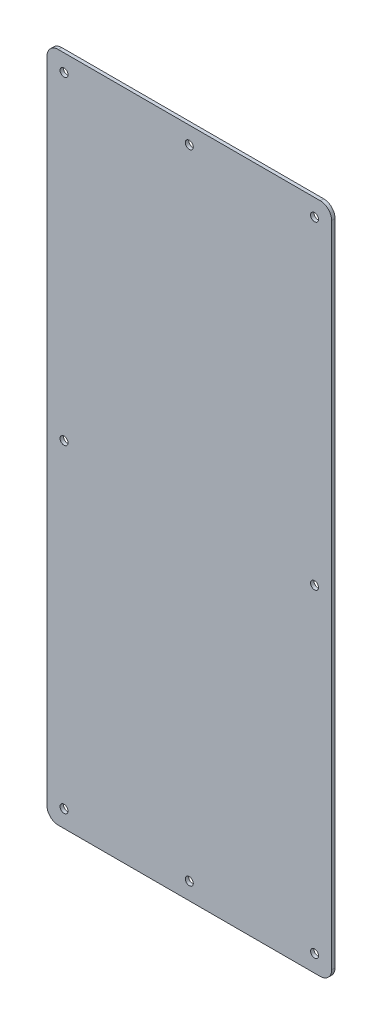
ISO-10303-21;
HEADER;
FILE_DESCRIPTION(('STEP AP214'),'2;1');
FILE_NAME('part.step','',(''),(''),'','','');
FILE_SCHEMA(('AUTOMOTIVE_DESIGN { 1 0 10303 214 1 1 1 1 }'));
ENDSEC;
DATA;
#1=APPLICATION_CONTEXT('core data for automotive mechanical design processes');
#2=APPLICATION_PROTOCOL_DEFINITION('international standard','automotive_design',2000,#1);
#3=PRODUCT_CONTEXT('',#1,'mechanical');
#4=PRODUCT('Part','Part','',(#3));
#5=PRODUCT_RELATED_PRODUCT_CATEGORY('part','',(#4));
#6=PRODUCT_DEFINITION_FORMATION('','',#4);
#7=PRODUCT_DEFINITION_CONTEXT('part definition',#1,'design');
#8=PRODUCT_DEFINITION('design','',#6,#7);
#9=PRODUCT_DEFINITION_SHAPE('','',#8);
#10=(LENGTH_UNIT() NAMED_UNIT(*) SI_UNIT(.MILLI.,.METRE.));
#11=(NAMED_UNIT(*) PLANE_ANGLE_UNIT() SI_UNIT($,.RADIAN.));
#12=(NAMED_UNIT(*) SI_UNIT($,.STERADIAN.) SOLID_ANGLE_UNIT());
#13=UNCERTAINTY_MEASURE_WITH_UNIT(LENGTH_MEASURE(1.E-05),#10,'distance_accuracy_value','');
#14=(GEOMETRIC_REPRESENTATION_CONTEXT(3) GLOBAL_UNCERTAINTY_ASSIGNED_CONTEXT((#13)) GLOBAL_UNIT_ASSIGNED_CONTEXT((#10,
#11,#12)) REPRESENTATION_CONTEXT('',''));
#15=CARTESIAN_POINT('',(0.,0.,0.));
#16=DIRECTION('',(0.,0.,1.));
#17=DIRECTION('',(1.,0.,0.));
#18=AXIS2_PLACEMENT_3D('',#15,#16,#17);
#19=CARTESIAN_POINT('',(125.,295.,3.));
#20=DIRECTION('',(-1.,0.,0.));
#21=DIRECTION('',(0.,-1.,0.));
#22=AXIS2_PLACEMENT_3D('',#19,#20,#21);
#23=PLANE('',#22);
#24=DIRECTION('',(0.,1.,0.));
#25=VECTOR('',#24,1.);
#26=CARTESIAN_POINT('',(125.,295.,3.));
#27=LINE('',#26,#25);
#28=CARTESIAN_POINT('',(125.,-285.,3.));
#29=VERTEX_POINT('',#28);
#30=CARTESIAN_POINT('',(125.,285.,3.));
#31=VERTEX_POINT('',#30);
#32=EDGE_CURVE('E119',#29,#31,#27,.T.);
#33=ORIENTED_EDGE('',*,*,#32,.F.);
#34=DIRECTION('',(0.,0.,-1.));
#35=VECTOR('',#34,1.);
#36=CARTESIAN_POINT('',(125.,-285.,3.));
#37=LINE('',#36,#35);
#38=CARTESIAN_POINT('',(125.,-285.,0.));
#39=VERTEX_POINT('',#38);
#40=EDGE_CURVE('E104',#29,#39,#37,.T.);
#41=ORIENTED_EDGE('',*,*,#40,.T.);
#42=DIRECTION('',(0.,1.,0.));
#43=VECTOR('',#42,1.);
#44=CARTESIAN_POINT('',(125.,295.,0.));
#45=LINE('',#44,#43);
#46=CARTESIAN_POINT('',(125.,285.,0.));
#47=VERTEX_POINT('',#46);
#48=EDGE_CURVE('E116',#39,#47,#45,.T.);
#49=ORIENTED_EDGE('',*,*,#48,.T.);
#50=DIRECTION('',(0.,0.,-1.));
#51=VECTOR('',#50,1.);
#52=CARTESIAN_POINT('',(125.,285.,3.));
#53=LINE('',#52,#51);
#54=EDGE_CURVE('E121',#47,#31,#53,.F.);
#55=ORIENTED_EDGE('',*,*,#54,.T.);
#56=EDGE_LOOP('',(#33,#41,#49,#55));
#57=FACE_BOUND('',#56,.T.);
#58=ADVANCED_FACE('F34',(#57),#23,.F.);
#59=CARTESIAN_POINT('',(-125.,295.,3.));
#60=DIRECTION('',(0.,-1.,0.));
#61=DIRECTION('',(0.,0.,-1.));
#62=AXIS2_PLACEMENT_3D('',#59,#60,#61);
#63=PLANE('',#62);
#64=DIRECTION('',(-1.,0.,0.));
#65=VECTOR('',#64,1.);
#66=CARTESIAN_POINT('',(-125.,295.,0.));
#67=LINE('',#66,#65);
#68=CARTESIAN_POINT('',(115.,295.,0.));
#69=VERTEX_POINT('',#68);
#70=CARTESIAN_POINT('',(-115.,295.,0.));
#71=VERTEX_POINT('',#70);
#72=EDGE_CURVE('E125',#69,#71,#67,.T.);
#73=ORIENTED_EDGE('',*,*,#72,.T.);
#74=DIRECTION('',(0.,0.,-1.));
#75=VECTOR('',#74,1.);
#76=CARTESIAN_POINT('',(-115.,295.,3.));
#77=LINE('',#76,#75);
#78=CARTESIAN_POINT('',(-115.,295.,3.));
#79=VERTEX_POINT('',#78);
#80=EDGE_CURVE('E11',#71,#79,#77,.F.);
#81=ORIENTED_EDGE('',*,*,#80,.T.);
#82=DIRECTION('',(-1.,0.,0.));
#83=VECTOR('',#82,1.);
#84=CARTESIAN_POINT('',(-125.,295.,3.));
#85=LINE('',#84,#83);
#86=CARTESIAN_POINT('',(115.,295.,3.));
#87=VERTEX_POINT('',#86);
#88=EDGE_CURVE('E165',#87,#79,#85,.T.);
#89=ORIENTED_EDGE('',*,*,#88,.F.);
#90=DIRECTION('',(0.,0.,-1.));
#91=VECTOR('',#90,1.);
#92=CARTESIAN_POINT('',(115.,295.,3.));
#93=LINE('',#92,#91);
#94=EDGE_CURVE('E42',#87,#69,#93,.T.);
#95=ORIENTED_EDGE('',*,*,#94,.T.);
#96=EDGE_LOOP('',(#73,#81,#89,#95));
#97=FACE_BOUND('',#96,.T.);
#98=ADVANCED_FACE('F163',(#97),#63,.F.);
#99=CARTESIAN_POINT('',(-125.,295.,3.));
#100=DIRECTION('',(1.,0.,0.));
#101=DIRECTION('',(0.,1.,0.));
#102=AXIS2_PLACEMENT_3D('',#99,#100,#101);
#103=PLANE('',#102);
#104=DIRECTION('',(0.,-1.,0.));
#105=VECTOR('',#104,1.);
#106=CARTESIAN_POINT('',(-125.,295.,0.));
#107=LINE('',#106,#105);
#108=CARTESIAN_POINT('',(-125.,285.,0.));
#109=VERTEX_POINT('',#108);
#110=CARTESIAN_POINT('',(-125.,-285.,0.));
#111=VERTEX_POINT('',#110);
#112=EDGE_CURVE('E129',#109,#111,#107,.T.);
#113=ORIENTED_EDGE('',*,*,#112,.T.);
#114=DIRECTION('',(0.,0.,-1.));
#115=VECTOR('',#114,1.);
#116=CARTESIAN_POINT('',(-125.,-285.,3.));
#117=LINE('',#116,#115);
#118=CARTESIAN_POINT('',(-125.,-285.,3.));
#119=VERTEX_POINT('',#118);
#120=EDGE_CURVE('E49',#111,#119,#117,.F.);
#121=ORIENTED_EDGE('',*,*,#120,.T.);
#122=DIRECTION('',(0.,-1.,0.));
#123=VECTOR('',#122,1.);
#124=CARTESIAN_POINT('',(-125.,295.,3.));
#125=LINE('',#124,#123);
#126=CARTESIAN_POINT('',(-125.,285.,3.));
#127=VERTEX_POINT('',#126);
#128=EDGE_CURVE('E173',#127,#119,#125,.T.);
#129=ORIENTED_EDGE('',*,*,#128,.F.);
#130=DIRECTION('',(0.,0.,-1.));
#131=VECTOR('',#130,1.);
#132=CARTESIAN_POINT('',(-125.,285.,3.));
#133=LINE('',#132,#131);
#134=EDGE_CURVE('E156',#127,#109,#133,.T.);
#135=ORIENTED_EDGE('',*,*,#134,.T.);
#136=EDGE_LOOP('',(#113,#121,#129,#135));
#137=FACE_BOUND('',#136,.T.);
#138=ADVANCED_FACE('F172',(#137),#103,.F.);
#139=CARTESIAN_POINT('',(-125.,-295.,3.));
#140=DIRECTION('',(0.,1.,0.));
#141=DIRECTION('',(0.,0.,1.));
#142=AXIS2_PLACEMENT_3D('',#139,#140,#141);
#143=PLANE('',#142);
#144=DIRECTION('',(1.,0.,0.));
#145=VECTOR('',#144,1.);
#146=CARTESIAN_POINT('',(-125.,-295.,0.));
#147=LINE('',#146,#145);
#148=CARTESIAN_POINT('',(-115.,-295.,0.));
#149=VERTEX_POINT('',#148);
#150=CARTESIAN_POINT('',(115.,-295.,0.));
#151=VERTEX_POINT('',#150);
#152=EDGE_CURVE('E139',#149,#151,#147,.T.);
#153=ORIENTED_EDGE('',*,*,#152,.T.);
#154=DIRECTION('',(0.,0.,-1.));
#155=VECTOR('',#154,1.);
#156=CARTESIAN_POINT('',(115.,-295.,3.));
#157=LINE('',#156,#155);
#158=CARTESIAN_POINT('',(115.,-295.,3.));
#159=VERTEX_POINT('',#158);
#160=EDGE_CURVE('E105',#151,#159,#157,.F.);
#161=ORIENTED_EDGE('',*,*,#160,.T.);
#162=DIRECTION('',(1.,0.,0.));
#163=VECTOR('',#162,1.);
#164=CARTESIAN_POINT('',(-125.,-295.,3.));
#165=LINE('',#164,#163);
#166=CARTESIAN_POINT('',(-115.,-295.,3.));
#167=VERTEX_POINT('',#166);
#168=EDGE_CURVE('E135',#167,#159,#165,.T.);
#169=ORIENTED_EDGE('',*,*,#168,.F.);
#170=DIRECTION('',(0.,0.,-1.));
#171=VECTOR('',#170,1.);
#172=CARTESIAN_POINT('',(-115.,-295.,3.));
#173=LINE('',#172,#171);
#174=EDGE_CURVE('E110',#167,#149,#173,.T.);
#175=ORIENTED_EDGE('',*,*,#174,.T.);
#176=EDGE_LOOP('',(#153,#161,#169,#175));
#177=FACE_BOUND('',#176,.T.);
#178=ADVANCED_FACE('F236',(#177),#143,.F.);
#179=CARTESIAN_POINT('',(125.,-295.,3.));
#180=DIRECTION('',(0.,0.,1.));
#181=DIRECTION('',(1.,0.,0.));
#182=AXIS2_PLACEMENT_3D('',#179,#180,#181);
#183=PLANE('',#182);
#184=CARTESIAN_POINT('',(0.,-280.,3.));
#185=DIRECTION('',(0.,0.,1.));
#186=DIRECTION('',(1.,0.,0.));
#187=AXIS2_PLACEMENT_3D('',#184,#185,#186);
#188=CIRCLE('',#187,3.5);
#189=CARTESIAN_POINT('',(3.5,-280.,3.));
#190=VERTEX_POINT('',#189);
#191=EDGE_CURVE('E218',#190,#190,#188,.T.);
#192=ORIENTED_EDGE('',*,*,#191,.F.);
#193=EDGE_LOOP('',(#192));
#194=FACE_BOUND('',#193,.T.);
#195=CARTESIAN_POINT('',(0.,280.,3.));
#196=DIRECTION('',(0.,0.,1.));
#197=DIRECTION('',(1.,0.,0.));
#198=AXIS2_PLACEMENT_3D('',#195,#196,#197);
#199=CIRCLE('',#198,3.5);
#200=CARTESIAN_POINT('',(3.5,280.,3.));
#201=VERTEX_POINT('',#200);
#202=EDGE_CURVE('E212',#201,#201,#199,.T.);
#203=ORIENTED_EDGE('',*,*,#202,.F.);
#204=EDGE_LOOP('',(#203));
#205=FACE_BOUND('',#204,.T.);
#206=CARTESIAN_POINT('',(110.,0.,3.));
#207=DIRECTION('',(0.,0.,1.));
#208=DIRECTION('',(1.,0.,0.));
#209=AXIS2_PLACEMENT_3D('',#206,#207,#208);
#210=CIRCLE('',#209,3.49999999999999);
#211=CARTESIAN_POINT('',(113.5,0.,3.));
#212=VERTEX_POINT('',#211);
#213=EDGE_CURVE('E206',#212,#212,#210,.T.);
#214=ORIENTED_EDGE('',*,*,#213,.F.);
#215=EDGE_LOOP('',(#214));
#216=FACE_BOUND('',#215,.T.);
#217=CARTESIAN_POINT('',(-110.,0.,3.));
#218=DIRECTION('',(0.,0.,1.));
#219=DIRECTION('',(1.,0.,0.));
#220=AXIS2_PLACEMENT_3D('',#217,#218,#219);
#221=CIRCLE('',#220,3.49999999999999);
#222=CARTESIAN_POINT('',(-106.5,0.,3.));
#223=VERTEX_POINT('',#222);
#224=EDGE_CURVE('E200',#223,#223,#221,.T.);
#225=ORIENTED_EDGE('',*,*,#224,.F.);
#226=EDGE_LOOP('',(#225));
#227=FACE_BOUND('',#226,.T.);
#228=CARTESIAN_POINT('',(110.,-280.,3.));
#229=DIRECTION('',(0.,0.,1.));
#230=DIRECTION('',(1.,0.,0.));
#231=AXIS2_PLACEMENT_3D('',#228,#229,#230);
#232=CIRCLE('',#231,3.49999999999999);
#233=CARTESIAN_POINT('',(113.5,-280.,3.));
#234=VERTEX_POINT('',#233);
#235=EDGE_CURVE('E194',#234,#234,#232,.T.);
#236=ORIENTED_EDGE('',*,*,#235,.F.);
#237=EDGE_LOOP('',(#236));
#238=FACE_BOUND('',#237,.T.);
#239=CARTESIAN_POINT('',(110.,280.,3.));
#240=DIRECTION('',(0.,0.,1.));
#241=DIRECTION('',(1.,0.,0.));
#242=AXIS2_PLACEMENT_3D('',#239,#240,#241);
#243=CIRCLE('',#242,3.49999999999999);
#244=CARTESIAN_POINT('',(113.5,280.,3.));
#245=VERTEX_POINT('',#244);
#246=EDGE_CURVE('E188',#245,#245,#243,.T.);
#247=ORIENTED_EDGE('',*,*,#246,.F.);
#248=EDGE_LOOP('',(#247));
#249=FACE_BOUND('',#248,.T.);
#250=CARTESIAN_POINT('',(-110.,-280.,3.));
#251=DIRECTION('',(0.,0.,1.));
#252=DIRECTION('',(1.,0.,0.));
#253=AXIS2_PLACEMENT_3D('',#250,#251,#252);
#254=CIRCLE('',#253,3.49999999999999);
#255=CARTESIAN_POINT('',(-106.5,-280.,3.));
#256=VERTEX_POINT('',#255);
#257=EDGE_CURVE('E182',#256,#256,#254,.T.);
#258=ORIENTED_EDGE('',*,*,#257,.F.);
#259=EDGE_LOOP('',(#258));
#260=FACE_BOUND('',#259,.T.);
#261=CARTESIAN_POINT('',(-110.,280.,3.));
#262=DIRECTION('',(0.,0.,1.));
#263=DIRECTION('',(1.,0.,0.));
#264=AXIS2_PLACEMENT_3D('',#261,#262,#263);
#265=CIRCLE('',#264,3.49999999999999);
#266=CARTESIAN_POINT('',(-106.5,280.,3.));
#267=VERTEX_POINT('',#266);
#268=EDGE_CURVE('E132',#267,#267,#265,.T.);
#269=ORIENTED_EDGE('',*,*,#268,.F.);
#270=EDGE_LOOP('',(#269));
#271=FACE_BOUND('',#270,.T.);
#272=ORIENTED_EDGE('',*,*,#168,.T.);
#273=CARTESIAN_POINT('',(115.,-285.,3.));
#274=DIRECTION('',(0.,0.,1.));
#275=DIRECTION('',(1.,0.,0.));
#276=AXIS2_PLACEMENT_3D('',#273,#274,#275);
#277=CIRCLE('',#276,10.);
#278=EDGE_CURVE('E154',#159,#29,#277,.T.);
#279=ORIENTED_EDGE('',*,*,#278,.T.);
#280=ORIENTED_EDGE('',*,*,#32,.T.);
#281=CARTESIAN_POINT('',(115.,285.,3.));
#282=DIRECTION('',(0.,0.,1.));
#283=DIRECTION('',(1.,0.,0.));
#284=AXIS2_PLACEMENT_3D('',#281,#282,#283);
#285=CIRCLE('',#284,10.);
#286=EDGE_CURVE('E149',#31,#87,#285,.T.);
#287=ORIENTED_EDGE('',*,*,#286,.T.);
#288=ORIENTED_EDGE('',*,*,#88,.T.);
#289=CARTESIAN_POINT('',(-115.,285.,3.));
#290=DIRECTION('',(0.,0.,1.));
#291=DIRECTION('',(1.,0.,0.));
#292=AXIS2_PLACEMENT_3D('',#289,#290,#291);
#293=CIRCLE('',#292,10.);
#294=EDGE_CURVE('E56',#79,#127,#293,.T.);
#295=ORIENTED_EDGE('',*,*,#294,.T.);
#296=ORIENTED_EDGE('',*,*,#128,.T.);
#297=CARTESIAN_POINT('',(-115.,-285.,3.));
#298=DIRECTION('',(0.,0.,1.));
#299=DIRECTION('',(1.,0.,0.));
#300=AXIS2_PLACEMENT_3D('',#297,#298,#299);
#301=CIRCLE('',#300,10.);
#302=EDGE_CURVE('E152',#119,#167,#301,.T.);
#303=ORIENTED_EDGE('',*,*,#302,.T.);
#304=EDGE_LOOP('',(#272,#279,#280,#287,#288,#295,#296,#303));
#305=FACE_BOUND('',#304,.T.);
#306=ADVANCED_FACE('F233',(#194,#205,#216,#227,#238,#249,#260,#271,#305),#183,.T.);
#307=CARTESIAN_POINT('',(125.,-295.,0.));
#308=DIRECTION('',(0.,0.,1.));
#309=DIRECTION('',(1.,0.,0.));
#310=AXIS2_PLACEMENT_3D('',#307,#308,#309);
#311=PLANE('',#310);
#312=CARTESIAN_POINT('',(0.,-280.,0.));
#313=DIRECTION('',(0.,0.,1.));
#314=DIRECTION('',(1.,0.,0.));
#315=AXIS2_PLACEMENT_3D('',#312,#313,#314);
#316=CIRCLE('',#315,3.5);
#317=CARTESIAN_POINT('',(3.5,-280.,0.));
#318=VERTEX_POINT('',#317);
#319=EDGE_CURVE('E215',#318,#318,#316,.T.);
#320=ORIENTED_EDGE('',*,*,#319,.T.);
#321=EDGE_LOOP('',(#320));
#322=FACE_BOUND('',#321,.T.);
#323=CARTESIAN_POINT('',(0.,280.,0.));
#324=DIRECTION('',(0.,0.,1.));
#325=DIRECTION('',(1.,0.,0.));
#326=AXIS2_PLACEMENT_3D('',#323,#324,#325);
#327=CIRCLE('',#326,3.5);
#328=CARTESIAN_POINT('',(3.5,280.,0.));
#329=VERTEX_POINT('',#328);
#330=EDGE_CURVE('E209',#329,#329,#327,.T.);
#331=ORIENTED_EDGE('',*,*,#330,.T.);
#332=EDGE_LOOP('',(#331));
#333=FACE_BOUND('',#332,.T.);
#334=CARTESIAN_POINT('',(110.,0.,0.));
#335=DIRECTION('',(0.,0.,1.));
#336=DIRECTION('',(1.,0.,0.));
#337=AXIS2_PLACEMENT_3D('',#334,#335,#336);
#338=CIRCLE('',#337,3.49999999999999);
#339=CARTESIAN_POINT('',(113.5,0.,0.));
#340=VERTEX_POINT('',#339);
#341=EDGE_CURVE('E203',#340,#340,#338,.T.);
#342=ORIENTED_EDGE('',*,*,#341,.T.);
#343=EDGE_LOOP('',(#342));
#344=FACE_BOUND('',#343,.T.);
#345=CARTESIAN_POINT('',(-110.,0.,0.));
#346=DIRECTION('',(0.,0.,1.));
#347=DIRECTION('',(1.,0.,0.));
#348=AXIS2_PLACEMENT_3D('',#345,#346,#347);
#349=CIRCLE('',#348,3.49999999999999);
#350=CARTESIAN_POINT('',(-106.5,0.,0.));
#351=VERTEX_POINT('',#350);
#352=EDGE_CURVE('E197',#351,#351,#349,.T.);
#353=ORIENTED_EDGE('',*,*,#352,.T.);
#354=EDGE_LOOP('',(#353));
#355=FACE_BOUND('',#354,.T.);
#356=CARTESIAN_POINT('',(110.,-280.,0.));
#357=DIRECTION('',(0.,0.,1.));
#358=DIRECTION('',(1.,0.,0.));
#359=AXIS2_PLACEMENT_3D('',#356,#357,#358);
#360=CIRCLE('',#359,3.49999999999999);
#361=CARTESIAN_POINT('',(113.5,-280.,0.));
#362=VERTEX_POINT('',#361);
#363=EDGE_CURVE('E191',#362,#362,#360,.T.);
#364=ORIENTED_EDGE('',*,*,#363,.T.);
#365=EDGE_LOOP('',(#364));
#366=FACE_BOUND('',#365,.T.);
#367=CARTESIAN_POINT('',(110.,280.,0.));
#368=DIRECTION('',(0.,0.,1.));
#369=DIRECTION('',(1.,0.,0.));
#370=AXIS2_PLACEMENT_3D('',#367,#368,#369);
#371=CIRCLE('',#370,3.49999999999999);
#372=CARTESIAN_POINT('',(113.5,280.,0.));
#373=VERTEX_POINT('',#372);
#374=EDGE_CURVE('E185',#373,#373,#371,.T.);
#375=ORIENTED_EDGE('',*,*,#374,.T.);
#376=EDGE_LOOP('',(#375));
#377=FACE_BOUND('',#376,.T.);
#378=CARTESIAN_POINT('',(-110.,-280.,0.));
#379=DIRECTION('',(0.,0.,1.));
#380=DIRECTION('',(1.,0.,0.));
#381=AXIS2_PLACEMENT_3D('',#378,#379,#380);
#382=CIRCLE('',#381,3.49999999999999);
#383=CARTESIAN_POINT('',(-106.5,-280.,0.));
#384=VERTEX_POINT('',#383);
#385=EDGE_CURVE('E180',#384,#384,#382,.T.);
#386=ORIENTED_EDGE('',*,*,#385,.T.);
#387=EDGE_LOOP('',(#386));
#388=FACE_BOUND('',#387,.T.);
#389=CARTESIAN_POINT('',(-110.,280.,0.));
#390=DIRECTION('',(0.,0.,1.));
#391=DIRECTION('',(1.,0.,0.));
#392=AXIS2_PLACEMENT_3D('',#389,#390,#391);
#393=CIRCLE('',#392,3.49999999999999);
#394=CARTESIAN_POINT('',(-106.5,280.,0.));
#395=VERTEX_POINT('',#394);
#396=EDGE_CURVE('E126',#395,#395,#393,.T.);
#397=ORIENTED_EDGE('',*,*,#396,.T.);
#398=EDGE_LOOP('',(#397));
#399=FACE_BOUND('',#398,.T.);
#400=ORIENTED_EDGE('',*,*,#48,.F.);
#401=CARTESIAN_POINT('',(115.,-285.,0.));
#402=DIRECTION('',(0.,0.,1.));
#403=DIRECTION('',(1.,0.,0.));
#404=AXIS2_PLACEMENT_3D('',#401,#402,#403);
#405=CIRCLE('',#404,10.);
#406=EDGE_CURVE('E100',#39,#151,#405,.F.);
#407=ORIENTED_EDGE('',*,*,#406,.T.);
#408=ORIENTED_EDGE('',*,*,#152,.F.);
#409=CARTESIAN_POINT('',(-115.,-285.,0.));
#410=DIRECTION('',(0.,0.,1.));
#411=DIRECTION('',(1.,0.,0.));
#412=AXIS2_PLACEMENT_3D('',#409,#410,#411);
#413=CIRCLE('',#412,10.);
#414=EDGE_CURVE('E111',#149,#111,#413,.F.);
#415=ORIENTED_EDGE('',*,*,#414,.T.);
#416=ORIENTED_EDGE('',*,*,#112,.F.);
#417=CARTESIAN_POINT('',(-115.,285.,0.));
#418=DIRECTION('',(0.,0.,1.));
#419=DIRECTION('',(1.,0.,0.));
#420=AXIS2_PLACEMENT_3D('',#417,#418,#419);
#421=CIRCLE('',#420,10.);
#422=EDGE_CURVE('E143',#109,#71,#421,.F.);
#423=ORIENTED_EDGE('',*,*,#422,.T.);
#424=ORIENTED_EDGE('',*,*,#72,.F.);
#425=CARTESIAN_POINT('',(115.,285.,0.));
#426=DIRECTION('',(0.,0.,1.));
#427=DIRECTION('',(1.,0.,0.));
#428=AXIS2_PLACEMENT_3D('',#425,#426,#427);
#429=CIRCLE('',#428,10.);
#430=EDGE_CURVE('E120',#69,#47,#429,.F.);
#431=ORIENTED_EDGE('',*,*,#430,.T.);
#432=EDGE_LOOP('',(#400,#407,#408,#415,#416,#423,#424,#431));
#433=FACE_BOUND('',#432,.T.);
#434=ADVANCED_FACE('F123',(#322,#333,#344,#355,#366,#377,#388,#399,#433),#311,.F.);
#435=CARTESIAN_POINT('',(115.,-285.,3.));
#436=DIRECTION('',(0.,0.,-1.));
#437=DIRECTION('',(-1.,0.,0.));
#438=AXIS2_PLACEMENT_3D('',#435,#436,#437);
#439=CYLINDRICAL_SURFACE('',#438,10.);
#440=ORIENTED_EDGE('',*,*,#278,.F.);
#441=ORIENTED_EDGE('',*,*,#160,.F.);
#442=ORIENTED_EDGE('',*,*,#406,.F.);
#443=ORIENTED_EDGE('',*,*,#40,.F.);
#444=EDGE_LOOP('',(#440,#441,#442,#443));
#445=FACE_BOUND('',#444,.T.);
#446=ADVANCED_FACE('F103',(#445),#439,.T.);
#447=CARTESIAN_POINT('',(-115.,-285.,3.));
#448=DIRECTION('',(0.,0.,-1.));
#449=DIRECTION('',(-1.,0.,0.));
#450=AXIS2_PLACEMENT_3D('',#447,#448,#449);
#451=CYLINDRICAL_SURFACE('',#450,10.);
#452=ORIENTED_EDGE('',*,*,#302,.F.);
#453=ORIENTED_EDGE('',*,*,#120,.F.);
#454=ORIENTED_EDGE('',*,*,#414,.F.);
#455=ORIENTED_EDGE('',*,*,#174,.F.);
#456=EDGE_LOOP('',(#452,#453,#454,#455));
#457=FACE_BOUND('',#456,.T.);
#458=ADVANCED_FACE('F255',(#457),#451,.T.);
#459=CARTESIAN_POINT('',(-115.,285.,3.));
#460=DIRECTION('',(0.,0.,-1.));
#461=DIRECTION('',(-1.,0.,0.));
#462=AXIS2_PLACEMENT_3D('',#459,#460,#461);
#463=CYLINDRICAL_SURFACE('',#462,10.);
#464=ORIENTED_EDGE('',*,*,#294,.F.);
#465=ORIENTED_EDGE('',*,*,#80,.F.);
#466=ORIENTED_EDGE('',*,*,#422,.F.);
#467=ORIENTED_EDGE('',*,*,#134,.F.);
#468=EDGE_LOOP('',(#464,#465,#466,#467));
#469=FACE_BOUND('',#468,.T.);
#470=ADVANCED_FACE('F171',(#469),#463,.T.);
#471=CARTESIAN_POINT('',(115.,285.,3.));
#472=DIRECTION('',(0.,0.,-1.));
#473=DIRECTION('',(-1.,0.,0.));
#474=AXIS2_PLACEMENT_3D('',#471,#472,#473);
#475=CYLINDRICAL_SURFACE('',#474,10.);
#476=ORIENTED_EDGE('',*,*,#286,.F.);
#477=ORIENTED_EDGE('',*,*,#54,.F.);
#478=ORIENTED_EDGE('',*,*,#430,.F.);
#479=ORIENTED_EDGE('',*,*,#94,.F.);
#480=EDGE_LOOP('',(#476,#477,#478,#479));
#481=FACE_BOUND('',#480,.T.);
#482=ADVANCED_FACE('F36',(#481),#475,.T.);
#483=CARTESIAN_POINT('',(-110.,280.,0.));
#484=DIRECTION('',(0.,0.,1.));
#485=DIRECTION('',(1.,0.,0.));
#486=AXIS2_PLACEMENT_3D('',#483,#484,#485);
#487=CYLINDRICAL_SURFACE('',#486,3.49999999999999);
#488=ORIENTED_EDGE('',*,*,#396,.F.);
#489=EDGE_LOOP('',(#488));
#490=FACE_BOUND('',#489,.T.);
#491=ORIENTED_EDGE('',*,*,#268,.T.);
#492=EDGE_LOOP('',(#491));
#493=FACE_BOUND('',#492,.T.);
#494=ADVANCED_FACE('F276',(#490,#493),#487,.F.);
#495=CARTESIAN_POINT('',(-110.,-280.,0.));
#496=DIRECTION('',(0.,0.,1.));
#497=DIRECTION('',(1.,0.,0.));
#498=AXIS2_PLACEMENT_3D('',#495,#496,#497);
#499=CYLINDRICAL_SURFACE('',#498,3.49999999999999);
#500=ORIENTED_EDGE('',*,*,#385,.F.);
#501=EDGE_LOOP('',(#500));
#502=FACE_BOUND('',#501,.T.);
#503=ORIENTED_EDGE('',*,*,#257,.T.);
#504=EDGE_LOOP('',(#503));
#505=FACE_BOUND('',#504,.T.);
#506=ADVANCED_FACE('F279',(#502,#505),#499,.F.);
#507=CARTESIAN_POINT('',(110.,280.,0.));
#508=DIRECTION('',(0.,0.,1.));
#509=DIRECTION('',(1.,0.,0.));
#510=AXIS2_PLACEMENT_3D('',#507,#508,#509);
#511=CYLINDRICAL_SURFACE('',#510,3.49999999999999);
#512=ORIENTED_EDGE('',*,*,#374,.F.);
#513=EDGE_LOOP('',(#512));
#514=FACE_BOUND('',#513,.T.);
#515=ORIENTED_EDGE('',*,*,#246,.T.);
#516=EDGE_LOOP('',(#515));
#517=FACE_BOUND('',#516,.T.);
#518=ADVANCED_FACE('F283',(#514,#517),#511,.F.);
#519=CARTESIAN_POINT('',(110.,-280.,0.));
#520=DIRECTION('',(0.,0.,1.));
#521=DIRECTION('',(1.,0.,0.));
#522=AXIS2_PLACEMENT_3D('',#519,#520,#521);
#523=CYLINDRICAL_SURFACE('',#522,3.49999999999999);
#524=ORIENTED_EDGE('',*,*,#363,.F.);
#525=EDGE_LOOP('',(#524));
#526=FACE_BOUND('',#525,.T.);
#527=ORIENTED_EDGE('',*,*,#235,.T.);
#528=EDGE_LOOP('',(#527));
#529=FACE_BOUND('',#528,.T.);
#530=ADVANCED_FACE('F287',(#526,#529),#523,.F.);
#531=CARTESIAN_POINT('',(-110.,0.,0.));
#532=DIRECTION('',(0.,0.,1.));
#533=DIRECTION('',(1.,0.,0.));
#534=AXIS2_PLACEMENT_3D('',#531,#532,#533);
#535=CYLINDRICAL_SURFACE('',#534,3.49999999999999);
#536=ORIENTED_EDGE('',*,*,#352,.F.);
#537=EDGE_LOOP('',(#536));
#538=FACE_BOUND('',#537,.T.);
#539=ORIENTED_EDGE('',*,*,#224,.T.);
#540=EDGE_LOOP('',(#539));
#541=FACE_BOUND('',#540,.T.);
#542=ADVANCED_FACE('F291',(#538,#541),#535,.F.);
#543=CARTESIAN_POINT('',(110.,0.,0.));
#544=DIRECTION('',(0.,0.,1.));
#545=DIRECTION('',(1.,0.,0.));
#546=AXIS2_PLACEMENT_3D('',#543,#544,#545);
#547=CYLINDRICAL_SURFACE('',#546,3.49999999999999);
#548=ORIENTED_EDGE('',*,*,#341,.F.);
#549=EDGE_LOOP('',(#548));
#550=FACE_BOUND('',#549,.T.);
#551=ORIENTED_EDGE('',*,*,#213,.T.);
#552=EDGE_LOOP('',(#551));
#553=FACE_BOUND('',#552,.T.);
#554=ADVANCED_FACE('F295',(#550,#553),#547,.F.);
#555=CARTESIAN_POINT('',(0.,280.,0.));
#556=DIRECTION('',(0.,0.,1.));
#557=DIRECTION('',(1.,0.,0.));
#558=AXIS2_PLACEMENT_3D('',#555,#556,#557);
#559=CYLINDRICAL_SURFACE('',#558,3.5);
#560=ORIENTED_EDGE('',*,*,#330,.F.);
#561=EDGE_LOOP('',(#560));
#562=FACE_BOUND('',#561,.T.);
#563=ORIENTED_EDGE('',*,*,#202,.T.);
#564=EDGE_LOOP('',(#563));
#565=FACE_BOUND('',#564,.T.);
#566=ADVANCED_FACE('F229',(#562,#565),#559,.F.);
#567=CARTESIAN_POINT('',(0.,-280.,0.));
#568=DIRECTION('',(0.,0.,1.));
#569=DIRECTION('',(1.,0.,0.));
#570=AXIS2_PLACEMENT_3D('',#567,#568,#569);
#571=CYLINDRICAL_SURFACE('',#570,3.5);
#572=ORIENTED_EDGE('',*,*,#319,.F.);
#573=EDGE_LOOP('',(#572));
#574=FACE_BOUND('',#573,.T.);
#575=ORIENTED_EDGE('',*,*,#191,.T.);
#576=EDGE_LOOP('',(#575));
#577=FACE_BOUND('',#576,.T.);
#578=ADVANCED_FACE('F226',(#574,#577),#571,.F.);
#579=CLOSED_SHELL('',(#58,#98,#138,#178,#306,#434,#446,#458,#470,#482,#494,#506,#518,#530,#542,
#554,#566,#578));
#580=MANIFOLD_SOLID_BREP('B2',#579);
#581=ADVANCED_BREP_SHAPE_REPRESENTATION('',(#18,#580),#14);
#582=SHAPE_DEFINITION_REPRESENTATION(#9,#581);
ENDSEC;
END-ISO-10303-21;
